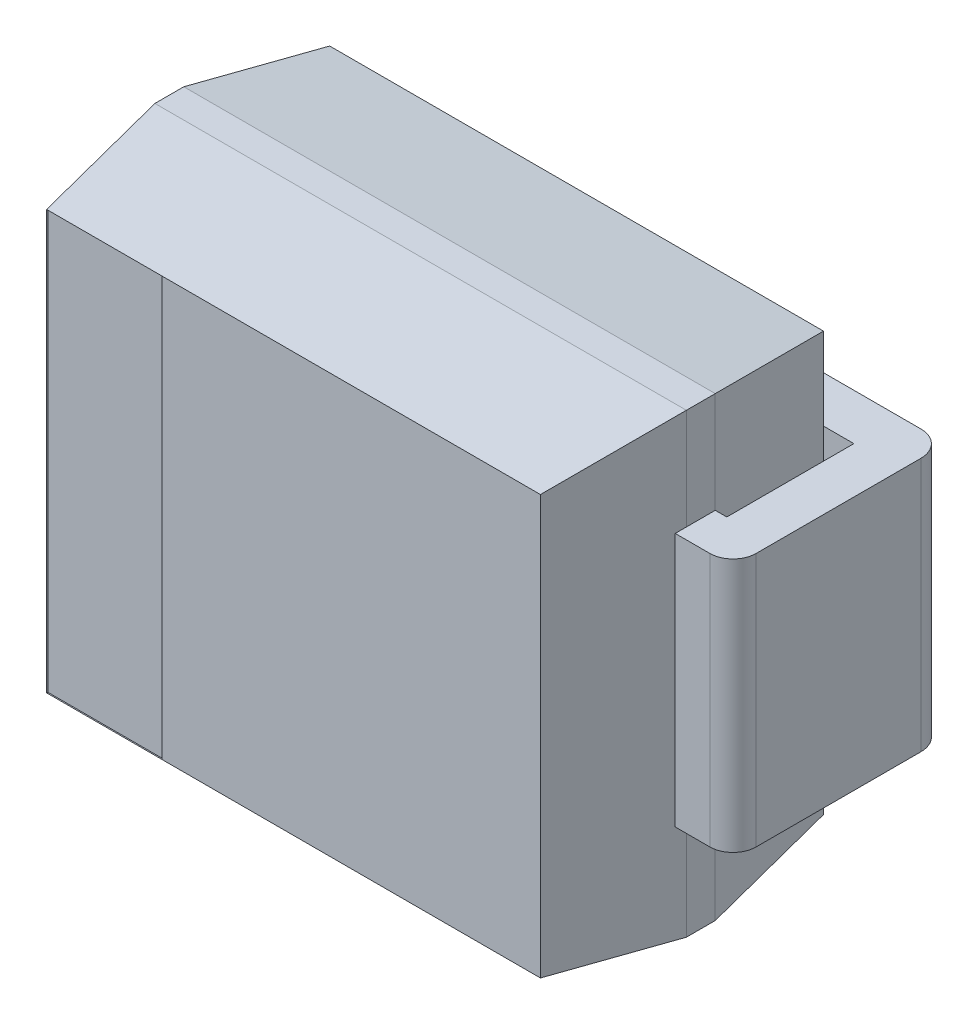
ISO-10303-21;
HEADER;
FILE_DESCRIPTION(('STEP AP214'),'2;1');
FILE_NAME('part.step','',(''),(''),'','','');
FILE_SCHEMA(('AUTOMOTIVE_DESIGN { 1 0 10303 214 1 1 1 1 }'));
ENDSEC;
DATA;
#1=APPLICATION_CONTEXT('core data for automotive mechanical design processes');
#2=APPLICATION_PROTOCOL_DEFINITION('international standard','automotive_design',2000,#1);
#3=PRODUCT_CONTEXT('',#1,'mechanical');
#4=PRODUCT('Part','Part','',(#3));
#5=PRODUCT_RELATED_PRODUCT_CATEGORY('part','',(#4));
#6=PRODUCT_DEFINITION_FORMATION('','',#4);
#7=PRODUCT_DEFINITION_CONTEXT('part definition',#1,'design');
#8=PRODUCT_DEFINITION('design','',#6,#7);
#9=PRODUCT_DEFINITION_SHAPE('','',#8);
#10=(LENGTH_UNIT() NAMED_UNIT(*) SI_UNIT(.MILLI.,.METRE.));
#11=(NAMED_UNIT(*) PLANE_ANGLE_UNIT() SI_UNIT($,.RADIAN.));
#12=(NAMED_UNIT(*) SI_UNIT($,.STERADIAN.) SOLID_ANGLE_UNIT());
#13=UNCERTAINTY_MEASURE_WITH_UNIT(LENGTH_MEASURE(1.E-05),#10,'distance_accuracy_value','');
#14=(GEOMETRIC_REPRESENTATION_CONTEXT(3) GLOBAL_UNCERTAINTY_ASSIGNED_CONTEXT((#13)) GLOBAL_UNIT_ASSIGNED_CONTEXT((#10,
#11,#12)) REPRESENTATION_CONTEXT('',''));
#15=CARTESIAN_POINT('',(0.,0.,0.));
#16=DIRECTION('',(0.,0.,1.));
#17=DIRECTION('',(1.,0.,0.));
#18=AXIS2_PLACEMENT_3D('',#15,#16,#17);
#19=CARTESIAN_POINT('',(2.3,-1.1,1.8464101615138));
#20=DIRECTION('',(-1.,0.,0.));
#21=DIRECTION('',(0.,0.,-1.));
#22=AXIS2_PLACEMENT_3D('',#19,#20,#21);
#23=PLANE('',#22);
#24=DIRECTION('',(0.,1.,0.));
#25=VECTOR('',#24,1.);
#26=CARTESIAN_POINT('',(2.3,-1.1,1.50000000000002));
#27=LINE('',#26,#25);
#28=CARTESIAN_POINT('',(2.3,-1.1,1.50000000000002));
#29=VERTEX_POINT('',#28);
#30=CARTESIAN_POINT('',(2.3,1.1,1.50000000000002));
#31=VERTEX_POINT('',#30);
#32=EDGE_CURVE('E53',#29,#31,#27,.T.);
#33=ORIENTED_EDGE('',*,*,#32,.F.);
#34=DIRECTION('',(0.,0.,-1.));
#35=VECTOR('',#34,1.);
#36=CARTESIAN_POINT('',(2.3,-1.1,1.8464101615138));
#37=LINE('',#36,#35);
#38=CARTESIAN_POINT('',(2.3,-1.1,1.8464101615138));
#39=VERTEX_POINT('',#38);
#40=EDGE_CURVE('E199',#39,#29,#37,.T.);
#41=ORIENTED_EDGE('',*,*,#40,.F.);
#42=DIRECTION('',(0.,1.,0.));
#43=VECTOR('',#42,1.);
#44=CARTESIAN_POINT('',(2.3,-1.1,1.8464101615138));
#45=LINE('',#44,#43);
#46=CARTESIAN_POINT('',(2.3,1.1,1.8464101615138));
#47=VERTEX_POINT('',#46);
#48=EDGE_CURVE('E12',#39,#47,#45,.T.);
#49=ORIENTED_EDGE('',*,*,#48,.T.);
#50=DIRECTION('',(0.,0.,-1.));
#51=VECTOR('',#50,1.);
#52=CARTESIAN_POINT('',(2.3,1.1,1.8464101615138));
#53=LINE('',#52,#51);
#54=EDGE_CURVE('E132',#47,#31,#53,.T.);
#55=ORIENTED_EDGE('',*,*,#54,.T.);
#56=EDGE_LOOP('',(#33,#41,#49,#55));
#57=FACE_BOUND('',#56,.T.);
#58=ADVANCED_FACE('F50',(#57),#23,.T.);
#59=CARTESIAN_POINT('',(2.6,-1.1,1.8464101615138));
#60=DIRECTION('',(0.,0.,1.));
#61=DIRECTION('',(-1.,0.,0.));
#62=AXIS2_PLACEMENT_3D('',#59,#60,#61);
#63=PLANE('',#62);
#64=ORIENTED_EDGE('',*,*,#48,.F.);
#65=DIRECTION('',(-1.,0.,0.));
#66=VECTOR('',#65,1.);
#67=CARTESIAN_POINT('',(2.6,-1.1,1.8464101615138));
#68=LINE('',#67,#66);
#69=CARTESIAN_POINT('',(2.6,-1.1,1.8464101615138));
#70=VERTEX_POINT('',#69);
#71=EDGE_CURVE('E66',#70,#39,#68,.T.);
#72=ORIENTED_EDGE('',*,*,#71,.F.);
#73=DIRECTION('',(0.,1.,0.));
#74=VECTOR('',#73,1.);
#75=CARTESIAN_POINT('',(2.6,-1.1,1.8464101615138));
#76=LINE('',#75,#74);
#77=CARTESIAN_POINT('',(2.6,1.1,1.8464101615138));
#78=VERTEX_POINT('',#77);
#79=EDGE_CURVE('E58',#70,#78,#76,.T.);
#80=ORIENTED_EDGE('',*,*,#79,.T.);
#81=DIRECTION('',(-1.,0.,0.));
#82=VECTOR('',#81,1.);
#83=CARTESIAN_POINT('',(2.6,1.1,1.8464101615138));
#84=LINE('',#83,#82);
#85=EDGE_CURVE('E197',#78,#47,#84,.T.);
#86=ORIENTED_EDGE('',*,*,#85,.T.);
#87=EDGE_LOOP('',(#64,#72,#80,#86));
#88=FACE_BOUND('',#87,.T.);
#89=ADVANCED_FACE('F221',(#88),#63,.T.);
#90=CARTESIAN_POINT('',(2.6,-1.1,1.6464101615138));
#91=DIRECTION('',(0.,1.,0.));
#92=DIRECTION('',(0.,0.,1.));
#93=AXIS2_PLACEMENT_3D('',#90,#91,#92);
#94=CYLINDRICAL_SURFACE('',#93,0.2);
#95=ORIENTED_EDGE('',*,*,#79,.F.);
#96=CARTESIAN_POINT('',(2.6,-1.1,1.6464101615138));
#97=DIRECTION('',(0.,-1.,0.));
#98=DIRECTION('',(0.,0.,-1.));
#99=AXIS2_PLACEMENT_3D('',#96,#97,#98);
#100=CIRCLE('',#99,0.2);
#101=CARTESIAN_POINT('',(2.8,-1.1,1.6464101615138));
#102=VERTEX_POINT('',#101);
#103=EDGE_CURVE('E71',#102,#70,#100,.T.);
#104=ORIENTED_EDGE('',*,*,#103,.F.);
#105=DIRECTION('',(0.,1.,0.));
#106=VECTOR('',#105,1.);
#107=CARTESIAN_POINT('',(2.8,-1.1,1.6464101615138));
#108=LINE('',#107,#106);
#109=CARTESIAN_POINT('',(2.8,1.1,1.6464101615138));
#110=VERTEX_POINT('',#109);
#111=EDGE_CURVE('E155',#102,#110,#108,.T.);
#112=ORIENTED_EDGE('',*,*,#111,.T.);
#113=CARTESIAN_POINT('',(2.6,1.1,1.6464101615138));
#114=DIRECTION('',(0.,-1.,0.));
#115=DIRECTION('',(0.,0.,-1.));
#116=AXIS2_PLACEMENT_3D('',#113,#114,#115);
#117=CIRCLE('',#116,0.2);
#118=EDGE_CURVE('E195',#110,#78,#117,.T.);
#119=ORIENTED_EDGE('',*,*,#118,.T.);
#120=EDGE_LOOP('',(#95,#104,#112,#119));
#121=FACE_BOUND('',#120,.T.);
#122=ADVANCED_FACE('F219',(#121),#94,.T.);
#123=CARTESIAN_POINT('',(2.8,-1.1,1.6464101615138));
#124=DIRECTION('',(1.,0.,0.));
#125=DIRECTION('',(0.,0.,1.));
#126=AXIS2_PLACEMENT_3D('',#123,#124,#125);
#127=PLANE('',#126);
#128=ORIENTED_EDGE('',*,*,#111,.F.);
#129=DIRECTION('',(0.,0.,1.));
#130=VECTOR('',#129,1.);
#131=CARTESIAN_POINT('',(2.8,-1.1,1.6464101615138));
#132=LINE('',#131,#130);
#133=CARTESIAN_POINT('',(2.8,-1.1,0.22));
#134=VERTEX_POINT('',#133);
#135=EDGE_CURVE('E149',#134,#102,#132,.T.);
#136=ORIENTED_EDGE('',*,*,#135,.F.);
#137=DIRECTION('',(0.,1.,0.));
#138=VECTOR('',#137,1.);
#139=CARTESIAN_POINT('',(2.8,-1.1,0.22));
#140=LINE('',#139,#138);
#141=CARTESIAN_POINT('',(2.8,1.1,0.22));
#142=VERTEX_POINT('',#141);
#143=EDGE_CURVE('E158',#134,#142,#140,.T.);
#144=ORIENTED_EDGE('',*,*,#143,.T.);
#145=DIRECTION('',(0.,0.,1.));
#146=VECTOR('',#145,1.);
#147=CARTESIAN_POINT('',(2.8,1.1,1.6464101615138));
#148=LINE('',#147,#146);
#149=EDGE_CURVE('E193',#142,#110,#148,.T.);
#150=ORIENTED_EDGE('',*,*,#149,.T.);
#151=EDGE_LOOP('',(#128,#136,#144,#150));
#152=FACE_BOUND('',#151,.T.);
#153=ADVANCED_FACE('F215',(#152),#127,.T.);
#154=CARTESIAN_POINT('',(2.58,-1.1,0.22));
#155=DIRECTION('',(0.,1.,0.));
#156=DIRECTION('',(0.,0.,1.));
#157=AXIS2_PLACEMENT_3D('',#154,#155,#156);
#158=CYLINDRICAL_SURFACE('',#157,0.22);
#159=ORIENTED_EDGE('',*,*,#143,.F.);
#160=CARTESIAN_POINT('',(2.58,-1.1,0.22));
#161=DIRECTION('',(0.,-1.,0.));
#162=DIRECTION('',(0.,0.,1.));
#163=AXIS2_PLACEMENT_3D('',#160,#161,#162);
#164=CIRCLE('',#163,0.22);
#165=CARTESIAN_POINT('',(2.58,-1.1,0.));
#166=VERTEX_POINT('',#165);
#167=EDGE_CURVE('E208',#166,#134,#164,.T.);
#168=ORIENTED_EDGE('',*,*,#167,.F.);
#169=DIRECTION('',(0.,1.,0.));
#170=VECTOR('',#169,1.);
#171=CARTESIAN_POINT('',(2.58,-1.1,0.));
#172=LINE('',#171,#170);
#173=CARTESIAN_POINT('',(2.58,1.1,0.));
#174=VERTEX_POINT('',#173);
#175=EDGE_CURVE('E161',#166,#174,#172,.T.);
#176=ORIENTED_EDGE('',*,*,#175,.T.);
#177=CARTESIAN_POINT('',(2.58,1.1,0.22));
#178=DIRECTION('',(0.,-1.,0.));
#179=DIRECTION('',(0.,0.,1.));
#180=AXIS2_PLACEMENT_3D('',#177,#178,#179);
#181=CIRCLE('',#180,0.22);
#182=EDGE_CURVE('E191',#174,#142,#181,.T.);
#183=ORIENTED_EDGE('',*,*,#182,.T.);
#184=EDGE_LOOP('',(#159,#168,#176,#183));
#185=FACE_BOUND('',#184,.T.);
#186=ADVANCED_FACE('F232',(#185),#158,.T.);
#187=CARTESIAN_POINT('',(1.3,-1.1,0.));
#188=DIRECTION('',(0.,0.,-1.));
#189=DIRECTION('',(1.,0.,0.));
#190=AXIS2_PLACEMENT_3D('',#187,#188,#189);
#191=PLANE('',#190);
#192=ORIENTED_EDGE('',*,*,#175,.F.);
#193=DIRECTION('',(1.,0.,0.));
#194=VECTOR('',#193,1.);
#195=CARTESIAN_POINT('',(1.3,-1.1,0.));
#196=LINE('',#195,#194);
#197=CARTESIAN_POINT('',(1.3,-1.1,0.));
#198=VERTEX_POINT('',#197);
#199=EDGE_CURVE('E206',#198,#166,#196,.T.);
#200=ORIENTED_EDGE('',*,*,#199,.F.);
#201=DIRECTION('',(0.,1.,0.));
#202=VECTOR('',#201,1.);
#203=CARTESIAN_POINT('',(1.3,-1.1,0.));
#204=LINE('',#203,#202);
#205=CARTESIAN_POINT('',(1.3,1.1,0.));
#206=VERTEX_POINT('',#205);
#207=EDGE_CURVE('E164',#198,#206,#204,.T.);
#208=ORIENTED_EDGE('',*,*,#207,.T.);
#209=DIRECTION('',(1.,0.,0.));
#210=VECTOR('',#209,1.);
#211=CARTESIAN_POINT('',(1.3,1.1,0.));
#212=LINE('',#211,#210);
#213=EDGE_CURVE('E187',#206,#174,#212,.T.);
#214=ORIENTED_EDGE('',*,*,#213,.T.);
#215=EDGE_LOOP('',(#192,#200,#208,#214));
#216=FACE_BOUND('',#215,.T.);
#217=ADVANCED_FACE('F229',(#216),#191,.T.);
#218=CARTESIAN_POINT('',(1.3,-1.1,0.));
#219=DIRECTION('',(-1.,0.,0.));
#220=DIRECTION('',(0.,0.,-1.));
#221=AXIS2_PLACEMENT_3D('',#218,#219,#220);
#222=PLANE('',#221);
#223=ORIENTED_EDGE('',*,*,#207,.F.);
#224=DIRECTION('',(0.,0.,-1.));
#225=VECTOR('',#224,1.);
#226=CARTESIAN_POINT('',(1.3,-1.1,0.));
#227=LINE('',#226,#225);
#228=CARTESIAN_POINT('',(1.3,-1.1,0.4));
#229=VERTEX_POINT('',#228);
#230=EDGE_CURVE('E204',#229,#198,#227,.T.);
#231=ORIENTED_EDGE('',*,*,#230,.F.);
#232=DIRECTION('',(0.,1.,0.));
#233=VECTOR('',#232,1.);
#234=CARTESIAN_POINT('',(1.3,-1.1,0.4));
#235=LINE('',#234,#233);
#236=CARTESIAN_POINT('',(1.3,1.1,0.4));
#237=VERTEX_POINT('',#236);
#238=EDGE_CURVE('E167',#229,#237,#235,.T.);
#239=ORIENTED_EDGE('',*,*,#238,.T.);
#240=DIRECTION('',(0.,0.,-1.));
#241=VECTOR('',#240,1.);
#242=CARTESIAN_POINT('',(1.3,1.1,0.));
#243=LINE('',#242,#241);
#244=EDGE_CURVE('E185',#237,#206,#243,.T.);
#245=ORIENTED_EDGE('',*,*,#244,.T.);
#246=EDGE_LOOP('',(#223,#231,#239,#245));
#247=FACE_BOUND('',#246,.T.);
#248=ADVANCED_FACE('F225',(#247),#222,.T.);
#249=CARTESIAN_POINT('',(1.3,-1.1,0.4));
#250=DIRECTION('',(0.,0.,1.));
#251=DIRECTION('',(-1.,0.,0.));
#252=AXIS2_PLACEMENT_3D('',#249,#250,#251);
#253=PLANE('',#252);
#254=ORIENTED_EDGE('',*,*,#238,.F.);
#255=DIRECTION('',(-1.,0.,0.));
#256=VECTOR('',#255,1.);
#257=CARTESIAN_POINT('',(1.3,-1.1,0.4));
#258=LINE('',#257,#256);
#259=CARTESIAN_POINT('',(2.4,-1.1,0.4));
#260=VERTEX_POINT('',#259);
#261=EDGE_CURVE('E178',#260,#229,#258,.T.);
#262=ORIENTED_EDGE('',*,*,#261,.F.);
#263=DIRECTION('',(0.,1.,0.));
#264=VECTOR('',#263,1.);
#265=CARTESIAN_POINT('',(2.4,-1.1,0.4));
#266=LINE('',#265,#264);
#267=CARTESIAN_POINT('',(2.4,1.1,0.4));
#268=VERTEX_POINT('',#267);
#269=EDGE_CURVE('E147',#260,#268,#266,.T.);
#270=ORIENTED_EDGE('',*,*,#269,.T.);
#271=DIRECTION('',(-1.,0.,0.));
#272=VECTOR('',#271,1.);
#273=CARTESIAN_POINT('',(1.3,1.1,0.4));
#274=LINE('',#273,#272);
#275=EDGE_CURVE('E176',#268,#237,#274,.T.);
#276=ORIENTED_EDGE('',*,*,#275,.T.);
#277=EDGE_LOOP('',(#254,#262,#270,#276));
#278=FACE_BOUND('',#277,.T.);
#279=ADVANCED_FACE('F175',(#278),#253,.T.);
#280=CARTESIAN_POINT('',(2.4,-1.1,0.4));
#281=DIRECTION('',(-1.,0.,0.));
#282=DIRECTION('',(0.,0.,-1.));
#283=AXIS2_PLACEMENT_3D('',#280,#281,#282);
#284=PLANE('',#283);
#285=ORIENTED_EDGE('',*,*,#269,.F.);
#286=DIRECTION('',(0.,0.,-1.));
#287=VECTOR('',#286,1.);
#288=CARTESIAN_POINT('',(2.4,-1.1,0.4));
#289=LINE('',#288,#287);
#290=CARTESIAN_POINT('',(2.4,-1.1,1.50000000000002));
#291=VERTEX_POINT('',#290);
#292=EDGE_CURVE('E182',#291,#260,#289,.T.);
#293=ORIENTED_EDGE('',*,*,#292,.F.);
#294=DIRECTION('',(0.,1.,0.));
#295=VECTOR('',#294,1.);
#296=CARTESIAN_POINT('',(2.4,-1.1,1.50000000000002));
#297=LINE('',#296,#295);
#298=CARTESIAN_POINT('',(2.4,1.1,1.50000000000002));
#299=VERTEX_POINT('',#298);
#300=EDGE_CURVE('E146',#291,#299,#297,.T.);
#301=ORIENTED_EDGE('',*,*,#300,.T.);
#302=DIRECTION('',(0.,0.,-1.));
#303=VECTOR('',#302,1.);
#304=CARTESIAN_POINT('',(2.4,1.1,0.4));
#305=LINE('',#304,#303);
#306=EDGE_CURVE('E134',#299,#268,#305,.T.);
#307=ORIENTED_EDGE('',*,*,#306,.T.);
#308=EDGE_LOOP('',(#285,#293,#301,#307));
#309=FACE_BOUND('',#308,.T.);
#310=ADVANCED_FACE('F181',(#309),#284,.T.);
#311=CARTESIAN_POINT('',(2.3,-1.1,1.50000000000002));
#312=DIRECTION('',(0.,0.,-1.));
#313=DIRECTION('',(1.,0.,0.));
#314=AXIS2_PLACEMENT_3D('',#311,#312,#313);
#315=PLANE('',#314);
#316=ORIENTED_EDGE('',*,*,#300,.F.);
#317=DIRECTION('',(1.,0.,0.));
#318=VECTOR('',#317,1.);
#319=CARTESIAN_POINT('',(2.3,-1.1,1.50000000000002));
#320=LINE('',#319,#318);
#321=EDGE_CURVE('E145',#29,#291,#320,.T.);
#322=ORIENTED_EDGE('',*,*,#321,.F.);
#323=ORIENTED_EDGE('',*,*,#32,.T.);
#324=DIRECTION('',(1.,0.,0.));
#325=VECTOR('',#324,1.);
#326=CARTESIAN_POINT('',(2.3,1.1,1.50000000000002));
#327=LINE('',#326,#325);
#328=EDGE_CURVE('E128',#31,#299,#327,.T.);
#329=ORIENTED_EDGE('',*,*,#328,.T.);
#330=EDGE_LOOP('',(#316,#322,#323,#329));
#331=FACE_BOUND('',#330,.T.);
#332=ADVANCED_FACE('F144',(#331),#315,.T.);
#333=CARTESIAN_POINT('',(2.58,-1.1,0.22));
#334=DIRECTION('',(0.,1.,0.));
#335=DIRECTION('',(0.,0.,1.));
#336=AXIS2_PLACEMENT_3D('',#333,#334,#335);
#337=PLANE('',#336);
#338=ORIENTED_EDGE('',*,*,#40,.T.);
#339=ORIENTED_EDGE('',*,*,#321,.T.);
#340=ORIENTED_EDGE('',*,*,#292,.T.);
#341=ORIENTED_EDGE('',*,*,#261,.T.);
#342=ORIENTED_EDGE('',*,*,#230,.T.);
#343=ORIENTED_EDGE('',*,*,#199,.T.);
#344=ORIENTED_EDGE('',*,*,#167,.T.);
#345=ORIENTED_EDGE('',*,*,#135,.T.);
#346=ORIENTED_EDGE('',*,*,#103,.T.);
#347=ORIENTED_EDGE('',*,*,#71,.T.);
#348=EDGE_LOOP('',(#338,#339,#340,#341,#342,#343,#344,#345,#346,#347));
#349=FACE_BOUND('',#348,.T.);
#350=ADVANCED_FACE('F211',(#349),#337,.F.);
#351=CARTESIAN_POINT('',(2.58,1.1,0.22));
#352=DIRECTION('',(0.,1.,0.));
#353=DIRECTION('',(0.,0.,1.));
#354=AXIS2_PLACEMENT_3D('',#351,#352,#353);
#355=PLANE('',#354);
#356=ORIENTED_EDGE('',*,*,#54,.F.);
#357=ORIENTED_EDGE('',*,*,#85,.F.);
#358=ORIENTED_EDGE('',*,*,#118,.F.);
#359=ORIENTED_EDGE('',*,*,#149,.F.);
#360=ORIENTED_EDGE('',*,*,#182,.F.);
#361=ORIENTED_EDGE('',*,*,#213,.F.);
#362=ORIENTED_EDGE('',*,*,#244,.F.);
#363=ORIENTED_EDGE('',*,*,#275,.F.);
#364=ORIENTED_EDGE('',*,*,#306,.F.);
#365=ORIENTED_EDGE('',*,*,#328,.F.);
#366=EDGE_LOOP('',(#356,#357,#358,#359,#360,#361,#362,#363,#364,#365));
#367=FACE_BOUND('',#366,.T.);
#368=ADVANCED_FACE('F130',(#367),#355,.T.);
#369=CLOSED_SHELL('',(#58,#89,#122,#153,#186,#217,#248,#279,#310,#332,#350,#368));
#370=MANIFOLD_SOLID_BREP('B2',#369);
#371=CARTESIAN_POINT('',(-2.3,-1.1,1.8464101615138));
#372=DIRECTION('',(1.,0.,0.));
#373=DIRECTION('',(0.,0.,-1.));
#374=AXIS2_PLACEMENT_3D('',#371,#372,#373);
#375=PLANE('',#374);
#376=DIRECTION('',(0.,1.,0.));
#377=VECTOR('',#376,1.);
#378=CARTESIAN_POINT('',(-2.3,-1.1,1.50000000000002));
#379=LINE('',#378,#377);
#380=CARTESIAN_POINT('',(-2.3,-1.1,1.50000000000002));
#381=VERTEX_POINT('',#380);
#382=CARTESIAN_POINT('',(-2.3,1.1,1.50000000000002));
#383=VERTEX_POINT('',#382);
#384=EDGE_CURVE('E366',#381,#383,#379,.T.);
#385=ORIENTED_EDGE('',*,*,#384,.T.);
#386=DIRECTION('',(0.,0.,-1.));
#387=VECTOR('',#386,1.);
#388=CARTESIAN_POINT('',(-2.3,1.1,1.8464101615138));
#389=LINE('',#388,#387);
#390=CARTESIAN_POINT('',(-2.3,1.1,1.8464101615138));
#391=VERTEX_POINT('',#390);
#392=EDGE_CURVE('E439',#391,#383,#389,.T.);
#393=ORIENTED_EDGE('',*,*,#392,.F.);
#394=DIRECTION('',(0.,1.,0.));
#395=VECTOR('',#394,1.);
#396=CARTESIAN_POINT('',(-2.3,-1.1,1.8464101615138));
#397=LINE('',#396,#395);
#398=CARTESIAN_POINT('',(-2.3,-1.1,1.8464101615138));
#399=VERTEX_POINT('',#398);
#400=EDGE_CURVE('E48',#399,#391,#397,.T.);
#401=ORIENTED_EDGE('',*,*,#400,.F.);
#402=DIRECTION('',(0.,0.,-1.));
#403=VECTOR('',#402,1.);
#404=CARTESIAN_POINT('',(-2.3,-1.1,1.8464101615138));
#405=LINE('',#404,#403);
#406=EDGE_CURVE('E440',#399,#381,#405,.T.);
#407=ORIENTED_EDGE('',*,*,#406,.T.);
#408=EDGE_LOOP('',(#385,#393,#401,#407));
#409=FACE_BOUND('',#408,.T.);
#410=ADVANCED_FACE('F363',(#409),#375,.T.);
#411=CARTESIAN_POINT('',(-2.6,-1.1,1.8464101615138));
#412=DIRECTION('',(0.,0.,1.));
#413=DIRECTION('',(1.,0.,0.));
#414=AXIS2_PLACEMENT_3D('',#411,#412,#413);
#415=PLANE('',#414);
#416=ORIENTED_EDGE('',*,*,#400,.T.);
#417=DIRECTION('',(1.,0.,0.));
#418=VECTOR('',#417,1.);
#419=CARTESIAN_POINT('',(-2.6,1.1,1.8464101615138));
#420=LINE('',#419,#418);
#421=CARTESIAN_POINT('',(-2.6,1.1,1.8464101615138));
#422=VERTEX_POINT('',#421);
#423=EDGE_CURVE('E457',#422,#391,#420,.T.);
#424=ORIENTED_EDGE('',*,*,#423,.F.);
#425=DIRECTION('',(0.,1.,0.));
#426=VECTOR('',#425,1.);
#427=CARTESIAN_POINT('',(-2.6,-1.1,1.8464101615138));
#428=LINE('',#427,#426);
#429=CARTESIAN_POINT('',(-2.6,-1.1,1.8464101615138));
#430=VERTEX_POINT('',#429);
#431=EDGE_CURVE('E371',#430,#422,#428,.T.);
#432=ORIENTED_EDGE('',*,*,#431,.F.);
#433=DIRECTION('',(1.,0.,0.));
#434=VECTOR('',#433,1.);
#435=CARTESIAN_POINT('',(-2.6,-1.1,1.8464101615138));
#436=LINE('',#435,#434);
#437=EDGE_CURVE('E445',#430,#399,#436,.T.);
#438=ORIENTED_EDGE('',*,*,#437,.T.);
#439=EDGE_LOOP('',(#416,#424,#432,#438));
#440=FACE_BOUND('',#439,.T.);
#441=ADVANCED_FACE('F545',(#440),#415,.T.);
#442=CARTESIAN_POINT('',(-2.6,-1.1,1.6464101615138));
#443=DIRECTION('',(0.,1.,0.));
#444=DIRECTION('',(0.,0.,1.));
#445=AXIS2_PLACEMENT_3D('',#442,#443,#444);
#446=CYLINDRICAL_SURFACE('',#445,0.2);
#447=ORIENTED_EDGE('',*,*,#431,.T.);
#448=CARTESIAN_POINT('',(-2.6,1.1,1.6464101615138));
#449=DIRECTION('',(0.,1.,0.));
#450=DIRECTION('',(0.,0.,-1.));
#451=AXIS2_PLACEMENT_3D('',#448,#449,#450);
#452=CIRCLE('',#451,0.2);
#453=CARTESIAN_POINT('',(-2.8,1.1,1.6464101615138));
#454=VERTEX_POINT('',#453);
#455=EDGE_CURVE('E476',#454,#422,#452,.T.);
#456=ORIENTED_EDGE('',*,*,#455,.F.);
#457=DIRECTION('',(0.,1.,0.));
#458=VECTOR('',#457,1.);
#459=CARTESIAN_POINT('',(-2.8,-1.1,1.6464101615138));
#460=LINE('',#459,#458);
#461=CARTESIAN_POINT('',(-2.8,-1.1,1.6464101615138));
#462=VERTEX_POINT('',#461);
#463=EDGE_CURVE('E504',#462,#454,#460,.T.);
#464=ORIENTED_EDGE('',*,*,#463,.F.);
#465=CARTESIAN_POINT('',(-2.6,-1.1,1.6464101615138));
#466=DIRECTION('',(0.,1.,0.));
#467=DIRECTION('',(0.,0.,-1.));
#468=AXIS2_PLACEMENT_3D('',#465,#466,#467);
#469=CIRCLE('',#468,0.2);
#470=EDGE_CURVE('E500',#462,#430,#469,.T.);
#471=ORIENTED_EDGE('',*,*,#470,.T.);
#472=EDGE_LOOP('',(#447,#456,#464,#471));
#473=FACE_BOUND('',#472,.T.);
#474=ADVANCED_FACE('F543',(#473),#446,.T.);
#475=CARTESIAN_POINT('',(-2.8,-1.1,1.6464101615138));
#476=DIRECTION('',(-1.,0.,0.));
#477=DIRECTION('',(0.,0.,1.));
#478=AXIS2_PLACEMENT_3D('',#475,#476,#477);
#479=PLANE('',#478);
#480=ORIENTED_EDGE('',*,*,#463,.T.);
#481=DIRECTION('',(0.,0.,1.));
#482=VECTOR('',#481,1.);
#483=CARTESIAN_POINT('',(-2.8,1.1,1.6464101615138));
#484=LINE('',#483,#482);
#485=CARTESIAN_POINT('',(-2.8,1.1,0.22));
#486=VERTEX_POINT('',#485);
#487=EDGE_CURVE('E473',#486,#454,#484,.T.);
#488=ORIENTED_EDGE('',*,*,#487,.F.);
#489=DIRECTION('',(0.,1.,0.));
#490=VECTOR('',#489,1.);
#491=CARTESIAN_POINT('',(-2.8,-1.1,0.22));
#492=LINE('',#491,#490);
#493=CARTESIAN_POINT('',(-2.8,-1.1,0.22));
#494=VERTEX_POINT('',#493);
#495=EDGE_CURVE('E506',#494,#486,#492,.T.);
#496=ORIENTED_EDGE('',*,*,#495,.F.);
#497=DIRECTION('',(0.,0.,1.));
#498=VECTOR('',#497,1.);
#499=CARTESIAN_POINT('',(-2.8,-1.1,1.6464101615138));
#500=LINE('',#499,#498);
#501=EDGE_CURVE('E497',#494,#462,#500,.T.);
#502=ORIENTED_EDGE('',*,*,#501,.T.);
#503=EDGE_LOOP('',(#480,#488,#496,#502));
#504=FACE_BOUND('',#503,.T.);
#505=ADVANCED_FACE('F539',(#504),#479,.T.);
#506=CARTESIAN_POINT('',(-2.58,-1.1,0.22));
#507=DIRECTION('',(0.,1.,0.));
#508=DIRECTION('',(0.,0.,1.));
#509=AXIS2_PLACEMENT_3D('',#506,#507,#508);
#510=CYLINDRICAL_SURFACE('',#509,0.22);
#511=ORIENTED_EDGE('',*,*,#495,.T.);
#512=CARTESIAN_POINT('',(-2.58,1.1,0.22));
#513=DIRECTION('',(0.,1.,0.));
#514=DIRECTION('',(0.,0.,1.));
#515=AXIS2_PLACEMENT_3D('',#512,#513,#514);
#516=CIRCLE('',#515,0.22);
#517=CARTESIAN_POINT('',(-2.58,1.1,0.));
#518=VERTEX_POINT('',#517);
#519=EDGE_CURVE('E470',#518,#486,#516,.T.);
#520=ORIENTED_EDGE('',*,*,#519,.F.);
#521=DIRECTION('',(0.,1.,0.));
#522=VECTOR('',#521,1.);
#523=CARTESIAN_POINT('',(-2.58,-1.1,0.));
#524=LINE('',#523,#522);
#525=CARTESIAN_POINT('',(-2.58,-1.1,0.));
#526=VERTEX_POINT('',#525);
#527=EDGE_CURVE('E508',#526,#518,#524,.T.);
#528=ORIENTED_EDGE('',*,*,#527,.F.);
#529=CARTESIAN_POINT('',(-2.58,-1.1,0.22));
#530=DIRECTION('',(0.,1.,0.));
#531=DIRECTION('',(0.,0.,1.));
#532=AXIS2_PLACEMENT_3D('',#529,#530,#531);
#533=CIRCLE('',#532,0.22);
#534=EDGE_CURVE('E494',#526,#494,#533,.T.);
#535=ORIENTED_EDGE('',*,*,#534,.T.);
#536=EDGE_LOOP('',(#511,#520,#528,#535));
#537=FACE_BOUND('',#536,.T.);
#538=ADVANCED_FACE('F537',(#537),#510,.T.);
#539=CARTESIAN_POINT('',(-1.3,-1.1,0.));
#540=DIRECTION('',(0.,0.,-1.));
#541=DIRECTION('',(-1.,0.,0.));
#542=AXIS2_PLACEMENT_3D('',#539,#540,#541);
#543=PLANE('',#542);
#544=ORIENTED_EDGE('',*,*,#527,.T.);
#545=DIRECTION('',(-1.,0.,0.));
#546=VECTOR('',#545,1.);
#547=CARTESIAN_POINT('',(-1.3,1.1,0.));
#548=LINE('',#547,#546);
#549=CARTESIAN_POINT('',(-1.3,1.1,0.));
#550=VERTEX_POINT('',#549);
#551=EDGE_CURVE('E467',#550,#518,#548,.T.);
#552=ORIENTED_EDGE('',*,*,#551,.F.);
#553=DIRECTION('',(0.,1.,0.));
#554=VECTOR('',#553,1.);
#555=CARTESIAN_POINT('',(-1.3,-1.1,0.));
#556=LINE('',#555,#554);
#557=CARTESIAN_POINT('',(-1.3,-1.1,0.));
#558=VERTEX_POINT('',#557);
#559=EDGE_CURVE('E510',#558,#550,#556,.T.);
#560=ORIENTED_EDGE('',*,*,#559,.F.);
#561=DIRECTION('',(-1.,0.,0.));
#562=VECTOR('',#561,1.);
#563=CARTESIAN_POINT('',(-1.3,-1.1,0.));
#564=LINE('',#563,#562);
#565=EDGE_CURVE('E491',#558,#526,#564,.T.);
#566=ORIENTED_EDGE('',*,*,#565,.T.);
#567=EDGE_LOOP('',(#544,#552,#560,#566));
#568=FACE_BOUND('',#567,.T.);
#569=ADVANCED_FACE('F532',(#568),#543,.T.);
#570=CARTESIAN_POINT('',(-1.3,-1.1,0.));
#571=DIRECTION('',(1.,0.,0.));
#572=DIRECTION('',(0.,0.,-1.));
#573=AXIS2_PLACEMENT_3D('',#570,#571,#572);
#574=PLANE('',#573);
#575=ORIENTED_EDGE('',*,*,#559,.T.);
#576=DIRECTION('',(0.,0.,-1.));
#577=VECTOR('',#576,1.);
#578=CARTESIAN_POINT('',(-1.3,1.1,0.));
#579=LINE('',#578,#577);
#580=CARTESIAN_POINT('',(-1.3,1.1,0.4));
#581=VERTEX_POINT('',#580);
#582=EDGE_CURVE('E464',#581,#550,#579,.T.);
#583=ORIENTED_EDGE('',*,*,#582,.F.);
#584=DIRECTION('',(0.,1.,0.));
#585=VECTOR('',#584,1.);
#586=CARTESIAN_POINT('',(-1.3,-1.1,0.4));
#587=LINE('',#586,#585);
#588=CARTESIAN_POINT('',(-1.3,-1.1,0.4));
#589=VERTEX_POINT('',#588);
#590=EDGE_CURVE('E512',#589,#581,#587,.T.);
#591=ORIENTED_EDGE('',*,*,#590,.F.);
#592=DIRECTION('',(0.,0.,-1.));
#593=VECTOR('',#592,1.);
#594=CARTESIAN_POINT('',(-1.3,-1.1,0.));
#595=LINE('',#594,#593);
#596=EDGE_CURVE('E488',#589,#558,#595,.T.);
#597=ORIENTED_EDGE('',*,*,#596,.T.);
#598=EDGE_LOOP('',(#575,#583,#591,#597));
#599=FACE_BOUND('',#598,.T.);
#600=ADVANCED_FACE('F525',(#599),#574,.T.);
#601=CARTESIAN_POINT('',(-1.3,-1.1,0.4));
#602=DIRECTION('',(0.,0.,1.));
#603=DIRECTION('',(1.,0.,0.));
#604=AXIS2_PLACEMENT_3D('',#601,#602,#603);
#605=PLANE('',#604);
#606=ORIENTED_EDGE('',*,*,#590,.T.);
#607=DIRECTION('',(1.,0.,0.));
#608=VECTOR('',#607,1.);
#609=CARTESIAN_POINT('',(-1.3,1.1,0.4));
#610=LINE('',#609,#608);
#611=CARTESIAN_POINT('',(-2.4,1.1,0.4));
#612=VERTEX_POINT('',#611);
#613=EDGE_CURVE('E461',#612,#581,#610,.T.);
#614=ORIENTED_EDGE('',*,*,#613,.F.);
#615=DIRECTION('',(0.,1.,0.));
#616=VECTOR('',#615,1.);
#617=CARTESIAN_POINT('',(-2.4,-1.1,0.4));
#618=LINE('',#617,#616);
#619=CARTESIAN_POINT('',(-2.4,-1.1,0.4));
#620=VERTEX_POINT('',#619);
#621=EDGE_CURVE('E514',#620,#612,#618,.T.);
#622=ORIENTED_EDGE('',*,*,#621,.F.);
#623=DIRECTION('',(1.,0.,0.));
#624=VECTOR('',#623,1.);
#625=CARTESIAN_POINT('',(-1.3,-1.1,0.4));
#626=LINE('',#625,#624);
#627=EDGE_CURVE('E485',#620,#589,#626,.T.);
#628=ORIENTED_EDGE('',*,*,#627,.T.);
#629=EDGE_LOOP('',(#606,#614,#622,#628));
#630=FACE_BOUND('',#629,.T.);
#631=ADVANCED_FACE('F522',(#630),#605,.T.);
#632=CARTESIAN_POINT('',(-2.4,-1.1,0.4));
#633=DIRECTION('',(1.,0.,0.));
#634=DIRECTION('',(0.,0.,-1.));
#635=AXIS2_PLACEMENT_3D('',#632,#633,#634);
#636=PLANE('',#635);
#637=ORIENTED_EDGE('',*,*,#621,.T.);
#638=DIRECTION('',(0.,0.,-1.));
#639=VECTOR('',#638,1.);
#640=CARTESIAN_POINT('',(-2.4,1.1,0.4));
#641=LINE('',#640,#639);
#642=CARTESIAN_POINT('',(-2.4,1.1,1.50000000000002));
#643=VERTEX_POINT('',#642);
#644=EDGE_CURVE('E452',#643,#612,#641,.T.);
#645=ORIENTED_EDGE('',*,*,#644,.F.);
#646=DIRECTION('',(0.,1.,0.));
#647=VECTOR('',#646,1.);
#648=CARTESIAN_POINT('',(-2.4,-1.1,1.50000000000002));
#649=LINE('',#648,#647);
#650=CARTESIAN_POINT('',(-2.4,-1.1,1.50000000000002));
#651=VERTEX_POINT('',#650);
#652=EDGE_CURVE('E444',#651,#643,#649,.T.);
#653=ORIENTED_EDGE('',*,*,#652,.F.);
#654=DIRECTION('',(0.,0.,-1.));
#655=VECTOR('',#654,1.);
#656=CARTESIAN_POINT('',(-2.4,-1.1,0.4));
#657=LINE('',#656,#655);
#658=EDGE_CURVE('E482',#651,#620,#657,.T.);
#659=ORIENTED_EDGE('',*,*,#658,.T.);
#660=EDGE_LOOP('',(#637,#645,#653,#659));
#661=FACE_BOUND('',#660,.T.);
#662=ADVANCED_FACE('F516',(#661),#636,.T.);
#663=CARTESIAN_POINT('',(-2.3,-1.1,1.50000000000002));
#664=DIRECTION('',(0.,0.,-1.));
#665=DIRECTION('',(-1.,0.,0.));
#666=AXIS2_PLACEMENT_3D('',#663,#664,#665);
#667=PLANE('',#666);
#668=ORIENTED_EDGE('',*,*,#652,.T.);
#669=DIRECTION('',(-1.,0.,0.));
#670=VECTOR('',#669,1.);
#671=CARTESIAN_POINT('',(-2.3,1.1,1.50000000000002));
#672=LINE('',#671,#670);
#673=EDGE_CURVE('E447',#383,#643,#672,.T.);
#674=ORIENTED_EDGE('',*,*,#673,.F.);
#675=ORIENTED_EDGE('',*,*,#384,.F.);
#676=DIRECTION('',(-1.,0.,0.));
#677=VECTOR('',#676,1.);
#678=CARTESIAN_POINT('',(-2.3,-1.1,1.50000000000002));
#679=LINE('',#678,#677);
#680=EDGE_CURVE('E480',#381,#651,#679,.T.);
#681=ORIENTED_EDGE('',*,*,#680,.T.);
#682=EDGE_LOOP('',(#668,#674,#675,#681));
#683=FACE_BOUND('',#682,.T.);
#684=ADVANCED_FACE('F448',(#683),#667,.T.);
#685=CARTESIAN_POINT('',(-2.58,-1.1,0.22));
#686=DIRECTION('',(0.,1.,0.));
#687=DIRECTION('',(0.,0.,1.));
#688=AXIS2_PLACEMENT_3D('',#685,#686,#687);
#689=PLANE('',#688);
#690=ORIENTED_EDGE('',*,*,#406,.F.);
#691=ORIENTED_EDGE('',*,*,#437,.F.);
#692=ORIENTED_EDGE('',*,*,#470,.F.);
#693=ORIENTED_EDGE('',*,*,#501,.F.);
#694=ORIENTED_EDGE('',*,*,#534,.F.);
#695=ORIENTED_EDGE('',*,*,#565,.F.);
#696=ORIENTED_EDGE('',*,*,#596,.F.);
#697=ORIENTED_EDGE('',*,*,#627,.F.);
#698=ORIENTED_EDGE('',*,*,#658,.F.);
#699=ORIENTED_EDGE('',*,*,#680,.F.);
#700=EDGE_LOOP('',(#690,#691,#692,#693,#694,#695,#696,#697,#698,#699));
#701=FACE_BOUND('',#700,.T.);
#702=ADVANCED_FACE('F528',(#701),#689,.F.);
#703=CARTESIAN_POINT('',(-2.58,1.1,0.22));
#704=DIRECTION('',(0.,1.,0.));
#705=DIRECTION('',(0.,0.,1.));
#706=AXIS2_PLACEMENT_3D('',#703,#704,#705);
#707=PLANE('',#706);
#708=ORIENTED_EDGE('',*,*,#392,.T.);
#709=ORIENTED_EDGE('',*,*,#673,.T.);
#710=ORIENTED_EDGE('',*,*,#644,.T.);
#711=ORIENTED_EDGE('',*,*,#613,.T.);
#712=ORIENTED_EDGE('',*,*,#582,.T.);
#713=ORIENTED_EDGE('',*,*,#551,.T.);
#714=ORIENTED_EDGE('',*,*,#519,.T.);
#715=ORIENTED_EDGE('',*,*,#487,.T.);
#716=ORIENTED_EDGE('',*,*,#455,.T.);
#717=ORIENTED_EDGE('',*,*,#423,.T.);
#718=EDGE_LOOP('',(#708,#709,#710,#711,#712,#713,#714,#715,#716,#717));
#719=FACE_BOUND('',#718,.T.);
#720=ADVANCED_FACE('F455',(#719),#707,.T.);
#721=CLOSED_SHELL('',(#410,#441,#474,#505,#538,#569,#600,#631,#662,#684,#702,#720));
#722=MANIFOLD_SOLID_BREP('B6',#721);
#723=CARTESIAN_POINT('',(2.3,1.975,2.85));
#724=DIRECTION('',(-1.,0.,0.));
#725=DIRECTION('',(0.,-1.,0.));
#726=AXIS2_PLACEMENT_3D('',#723,#724,#725);
#727=PLANE('',#726);
#728=DIRECTION('',(0.,0.,-1.));
#729=VECTOR('',#728,1.);
#730=CARTESIAN_POINT('',(2.3,-1.975,2.85));
#731=LINE('',#730,#729);
#732=CARTESIAN_POINT('',(2.3,-1.975,1.74999999999998));
#733=VERTEX_POINT('',#732);
#734=CARTESIAN_POINT('',(2.3,-1.975,1.50000000000002));
#735=VERTEX_POINT('',#734);
#736=EDGE_CURVE('E766',#733,#735,#731,.T.);
#737=ORIENTED_EDGE('',*,*,#736,.T.);
#738=DIRECTION('',(0.,1.,0.));
#739=VECTOR('',#738,1.);
#740=CARTESIAN_POINT('',(2.3,1.975,1.50000000000002));
#741=LINE('',#740,#739);
#742=CARTESIAN_POINT('',(2.3,1.975,1.50000000000002));
#743=VERTEX_POINT('',#742);
#744=EDGE_CURVE('E795',#735,#743,#741,.T.);
#745=ORIENTED_EDGE('',*,*,#744,.T.);
#746=DIRECTION('',(0.,0.,-1.));
#747=VECTOR('',#746,1.);
#748=CARTESIAN_POINT('',(2.3,1.975,2.85));
#749=LINE('',#748,#747);
#750=CARTESIAN_POINT('',(2.3,1.975,1.74999999999998));
#751=VERTEX_POINT('',#750);
#752=EDGE_CURVE('E774',#751,#743,#749,.T.);
#753=ORIENTED_EDGE('',*,*,#752,.F.);
#754=DIRECTION('',(0.,-1.,0.));
#755=VECTOR('',#754,1.);
#756=CARTESIAN_POINT('',(2.3,-1.975,1.74999999999998));
#757=LINE('',#756,#755);
#758=EDGE_CURVE('E789',#751,#733,#757,.T.);
#759=ORIENTED_EDGE('',*,*,#758,.T.);
#760=EDGE_LOOP('',(#737,#745,#753,#759));
#761=FACE_BOUND('',#760,.T.);
#762=ADVANCED_FACE('F643',(#761),#727,.F.);
#763=CARTESIAN_POINT('',(-2.3,1.975,2.85));
#764=DIRECTION('',(0.,-1.,0.));
#765=DIRECTION('',(0.,0.,-1.));
#766=AXIS2_PLACEMENT_3D('',#763,#764,#765);
#767=PLANE('',#766);
#768=ORIENTED_EDGE('',*,*,#752,.T.);
#769=DIRECTION('',(-1.,0.,0.));
#770=VECTOR('',#769,1.);
#771=CARTESIAN_POINT('',(-2.3,1.975,1.50000000000002));
#772=LINE('',#771,#770);
#773=CARTESIAN_POINT('',(-2.3,1.975,1.50000000000002));
#774=VERTEX_POINT('',#773);
#775=EDGE_CURVE('E817',#743,#774,#772,.T.);
#776=ORIENTED_EDGE('',*,*,#775,.T.);
#777=DIRECTION('',(0.,0.,-1.));
#778=VECTOR('',#777,1.);
#779=CARTESIAN_POINT('',(-2.3,1.975,2.85));
#780=LINE('',#779,#778);
#781=CARTESIAN_POINT('',(-2.3,1.975,1.74999999999998));
#782=VERTEX_POINT('',#781);
#783=EDGE_CURVE('E772',#782,#774,#780,.T.);
#784=ORIENTED_EDGE('',*,*,#783,.F.);
#785=DIRECTION('',(1.,0.,0.));
#786=VECTOR('',#785,1.);
#787=CARTESIAN_POINT('',(2.3,1.975,1.74999999999998));
#788=LINE('',#787,#786);
#789=EDGE_CURVE('E786',#782,#751,#788,.T.);
#790=ORIENTED_EDGE('',*,*,#789,.T.);
#791=EDGE_LOOP('',(#768,#776,#784,#790));
#792=FACE_BOUND('',#791,.T.);
#793=ADVANCED_FACE('F850',(#792),#767,.F.);
#794=CARTESIAN_POINT('',(-2.3,1.975,2.85));
#795=DIRECTION('',(1.,0.,0.));
#796=DIRECTION('',(0.,1.,0.));
#797=AXIS2_PLACEMENT_3D('',#794,#795,#796);
#798=PLANE('',#797);
#799=ORIENTED_EDGE('',*,*,#783,.T.);
#800=DIRECTION('',(0.,-1.,0.));
#801=VECTOR('',#800,1.);
#802=CARTESIAN_POINT('',(-2.3,1.975,1.50000000000002));
#803=LINE('',#802,#801);
#804=CARTESIAN_POINT('',(-2.3,-1.975,1.50000000000002));
#805=VERTEX_POINT('',#804);
#806=EDGE_CURVE('E361',#774,#805,#803,.T.);
#807=ORIENTED_EDGE('',*,*,#806,.T.);
#808=DIRECTION('',(0.,0.,-1.));
#809=VECTOR('',#808,1.);
#810=CARTESIAN_POINT('',(-2.3,-1.975,2.85));
#811=LINE('',#810,#809);
#812=CARTESIAN_POINT('',(-2.3,-1.975,1.74999999999998));
#813=VERTEX_POINT('',#812);
#814=EDGE_CURVE('E769',#813,#805,#811,.T.);
#815=ORIENTED_EDGE('',*,*,#814,.F.);
#816=DIRECTION('',(0.,1.,0.));
#817=VECTOR('',#816,1.);
#818=CARTESIAN_POINT('',(-2.3,1.975,1.74999999999998));
#819=LINE('',#818,#817);
#820=EDGE_CURVE('E793',#813,#782,#819,.T.);
#821=ORIENTED_EDGE('',*,*,#820,.T.);
#822=EDGE_LOOP('',(#799,#807,#815,#821));
#823=FACE_BOUND('',#822,.T.);
#824=ADVANCED_FACE('F887',(#823),#798,.F.);
#825=CARTESIAN_POINT('',(-2.3,-1.975,2.85));
#826=DIRECTION('',(0.,1.,0.));
#827=DIRECTION('',(0.,0.,1.));
#828=AXIS2_PLACEMENT_3D('',#825,#826,#827);
#829=PLANE('',#828);
#830=ORIENTED_EDGE('',*,*,#814,.T.);
#831=DIRECTION('',(1.,0.,0.));
#832=VECTOR('',#831,1.);
#833=CARTESIAN_POINT('',(-2.3,-1.975,1.50000000000002));
#834=LINE('',#833,#832);
#835=EDGE_CURVE('E652',#805,#735,#834,.T.);
#836=ORIENTED_EDGE('',*,*,#835,.T.);
#837=ORIENTED_EDGE('',*,*,#736,.F.);
#838=DIRECTION('',(-1.,0.,0.));
#839=VECTOR('',#838,1.);
#840=CARTESIAN_POINT('',(-2.3,-1.975,1.74999999999998));
#841=LINE('',#840,#839);
#842=EDGE_CURVE('E791',#733,#813,#841,.T.);
#843=ORIENTED_EDGE('',*,*,#842,.T.);
#844=EDGE_LOOP('',(#830,#836,#837,#843));
#845=FACE_BOUND('',#844,.T.);
#846=ADVANCED_FACE('F940',(#845),#829,.F.);
#847=CARTESIAN_POINT('',(0.,0.,2.85));
#848=DIRECTION('',(0.,0.,1.));
#849=DIRECTION('',(1.,0.,0.));
#850=AXIS2_PLACEMENT_3D('',#847,#848,#849);
#851=PLANE('',#850);
#852=DIRECTION('',(0.,1.,0.));
#853=VECTOR('',#852,1.);
#854=CARTESIAN_POINT('',(-1.137,-1.812,2.85));
#855=LINE('',#854,#853);
#856=CARTESIAN_POINT('',(-1.137,-1.812,2.85));
#857=VERTEX_POINT('',#856);
#858=CARTESIAN_POINT('',(-1.137,1.812,2.85));
#859=VERTEX_POINT('',#858);
#860=EDGE_CURVE('E660',#857,#859,#855,.T.);
#861=ORIENTED_EDGE('',*,*,#860,.F.);
#862=DIRECTION('',(1.,0.,0.));
#863=VECTOR('',#862,1.);
#864=CARTESIAN_POINT('',(2.3,-1.812,2.85));
#865=LINE('',#864,#863);
#866=CARTESIAN_POINT('',(2.137,-1.812,2.85));
#867=VERTEX_POINT('',#866);
#868=EDGE_CURVE('E778',#857,#867,#865,.T.);
#869=ORIENTED_EDGE('',*,*,#868,.T.);
#870=DIRECTION('',(0.,1.,0.));
#871=VECTOR('',#870,1.);
#872=CARTESIAN_POINT('',(2.137,1.975,2.85));
#873=LINE('',#872,#871);
#874=CARTESIAN_POINT('',(2.137,1.812,2.85));
#875=VERTEX_POINT('',#874);
#876=EDGE_CURVE('E781',#867,#875,#873,.T.);
#877=ORIENTED_EDGE('',*,*,#876,.T.);
#878=DIRECTION('',(-1.,0.,0.));
#879=VECTOR('',#878,1.);
#880=CARTESIAN_POINT('',(-2.3,1.812,2.85));
#881=LINE('',#880,#879);
#882=EDGE_CURVE('E783',#875,#859,#881,.T.);
#883=ORIENTED_EDGE('',*,*,#882,.T.);
#884=EDGE_LOOP('',(#861,#869,#877,#883));
#885=FACE_BOUND('',#884,.T.);
#886=ADVANCED_FACE('F869',(#885),#851,.T.);
#887=CARTESIAN_POINT('',(0.,0.,0.4));
#888=DIRECTION('',(0.,0.,1.));
#889=DIRECTION('',(1.,0.,0.));
#890=AXIS2_PLACEMENT_3D('',#887,#888,#889);
#891=PLANE('',#890);
#892=DIRECTION('',(1.,0.,0.));
#893=VECTOR('',#892,1.);
#894=CARTESIAN_POINT('',(0.,1.812,0.4));
#895=LINE('',#894,#893);
#896=CARTESIAN_POINT('',(-2.137,1.812,0.4));
#897=VERTEX_POINT('',#896);
#898=CARTESIAN_POINT('',(2.137,1.812,0.4));
#899=VERTEX_POINT('',#898);
#900=EDGE_CURVE('E812',#897,#899,#895,.T.);
#901=ORIENTED_EDGE('',*,*,#900,.T.);
#902=DIRECTION('',(0.,-1.,0.));
#903=VECTOR('',#902,1.);
#904=CARTESIAN_POINT('',(2.137,0.,0.4));
#905=LINE('',#904,#903);
#906=CARTESIAN_POINT('',(2.137,-1.812,0.4));
#907=VERTEX_POINT('',#906);
#908=EDGE_CURVE('E814',#899,#907,#905,.T.);
#909=ORIENTED_EDGE('',*,*,#908,.T.);
#910=DIRECTION('',(-1.,0.,0.));
#911=VECTOR('',#910,1.);
#912=CARTESIAN_POINT('',(0.,-1.812,0.4));
#913=LINE('',#912,#911);
#914=CARTESIAN_POINT('',(-2.137,-1.812,0.4));
#915=VERTEX_POINT('',#914);
#916=EDGE_CURVE('E810',#907,#915,#913,.T.);
#917=ORIENTED_EDGE('',*,*,#916,.T.);
#918=DIRECTION('',(0.,1.,0.));
#919=VECTOR('',#918,1.);
#920=CARTESIAN_POINT('',(-2.137,0.,0.4));
#921=LINE('',#920,#919);
#922=EDGE_CURVE('E808',#915,#897,#921,.T.);
#923=ORIENTED_EDGE('',*,*,#922,.T.);
#924=EDGE_LOOP('',(#901,#909,#917,#923));
#925=FACE_BOUND('',#924,.T.);
#926=ADVANCED_FACE('F838',(#925),#891,.F.);
#927=CARTESIAN_POINT('',(0.,-1.812,2.85));
#928=DIRECTION('',(0.,-0.989198633513711,0.146581252057028));
#929=DIRECTION('',(-1.,0.,0.));
#930=AXIS2_PLACEMENT_3D('',#927,#928,#929);
#931=PLANE('',#930);
#932=DIRECTION('',(0.145031455050628,0.145031455050628,0.978739880709781));
#933=VECTOR('',#932,1.);
#934=CARTESIAN_POINT('',(-2.09888616920717,-1.77388616920717,3.10720990105594));
#935=LINE('',#934,#933);
#936=CARTESIAN_POINT('',(-2.137,-1.812,2.85));
#937=VERTEX_POINT('',#936);
#938=EDGE_CURVE('E801',#813,#937,#935,.T.);
#939=ORIENTED_EDGE('',*,*,#938,.F.);
#940=ORIENTED_EDGE('',*,*,#842,.F.);
#941=DIRECTION('',(-0.145031455050628,0.145031455050628,0.978739880709781));
#942=VECTOR('',#941,1.);
#943=CARTESIAN_POINT('',(2.09205007924708,-1.76705007924708,3.15334302348595));
#944=LINE('',#943,#942);
#945=EDGE_CURVE('E770',#867,#733,#944,.F.);
#946=ORIENTED_EDGE('',*,*,#945,.F.);
#947=ORIENTED_EDGE('',*,*,#868,.F.);
#948=EDGE_CURVE('E779',#937,#857,#865,.T.);
#949=ORIENTED_EDGE('',*,*,#948,.F.);
#950=EDGE_LOOP('',(#939,#940,#946,#947,#949));
#951=FACE_BOUND('',#950,.T.);
#952=ADVANCED_FACE('F865',(#951),#931,.T.);
#953=CARTESIAN_POINT('',(2.137,0.,2.85));
#954=DIRECTION('',(0.989198633513711,0.,0.146581252057028));
#955=DIRECTION('',(0.,-1.,0.));
#956=AXIS2_PLACEMENT_3D('',#953,#954,#955);
#957=PLANE('',#956);
#958=ORIENTED_EDGE('',*,*,#945,.T.);
#959=ORIENTED_EDGE('',*,*,#758,.F.);
#960=DIRECTION('',(-0.145031455050628,-0.145031455050628,0.978739880709781));
#961=VECTOR('',#960,1.);
#962=CARTESIAN_POINT('',(2.09888616920717,1.77388616920717,3.10720990105594));
#963=LINE('',#962,#961);
#964=EDGE_CURVE('E799',#875,#751,#963,.F.);
#965=ORIENTED_EDGE('',*,*,#964,.F.);
#966=ORIENTED_EDGE('',*,*,#876,.F.);
#967=EDGE_LOOP('',(#958,#959,#965,#966));
#968=FACE_BOUND('',#967,.T.);
#969=ADVANCED_FACE('F895',(#968),#957,.T.);
#970=CARTESIAN_POINT('',(-2.137,0.,2.85));
#971=DIRECTION('',(-0.989198633513711,0.,0.146581252057028));
#972=DIRECTION('',(0.,1.,0.));
#973=AXIS2_PLACEMENT_3D('',#970,#971,#972);
#974=PLANE('',#973);
#975=ORIENTED_EDGE('',*,*,#938,.T.);
#976=DIRECTION('',(0.,-1.,0.));
#977=VECTOR('',#976,1.);
#978=CARTESIAN_POINT('',(-2.137,-1.975,2.85));
#979=LINE('',#978,#977);
#980=CARTESIAN_POINT('',(-2.137,1.812,2.85));
#981=VERTEX_POINT('',#980);
#982=EDGE_CURVE('E735',#981,#937,#979,.T.);
#983=ORIENTED_EDGE('',*,*,#982,.F.);
#984=DIRECTION('',(-0.145031455050628,0.145031455050628,-0.978739880709781));
#985=VECTOR('',#984,1.);
#986=CARTESIAN_POINT('',(-2.09888616920717,1.77388616920717,3.10720990105594));
#987=LINE('',#986,#985);
#988=EDGE_CURVE('E796',#782,#981,#987,.F.);
#989=ORIENTED_EDGE('',*,*,#988,.F.);
#990=ORIENTED_EDGE('',*,*,#820,.F.);
#991=EDGE_LOOP('',(#975,#983,#989,#990));
#992=FACE_BOUND('',#991,.T.);
#993=ADVANCED_FACE('F861',(#992),#974,.T.);
#994=CARTESIAN_POINT('',(0.,1.812,2.85));
#995=DIRECTION('',(0.,0.989198633513711,0.146581252057028));
#996=DIRECTION('',(1.,0.,0.));
#997=AXIS2_PLACEMENT_3D('',#994,#995,#996);
#998=PLANE('',#997);
#999=ORIENTED_EDGE('',*,*,#964,.T.);
#1000=ORIENTED_EDGE('',*,*,#789,.F.);
#1001=ORIENTED_EDGE('',*,*,#988,.T.);
#1002=DIRECTION('',(-1.,0.,0.));
#1003=VECTOR('',#1002,1.);
#1004=CARTESIAN_POINT('',(-2.137,1.812,2.85));
#1005=LINE('',#1004,#1003);
#1006=EDGE_CURVE('E752',#859,#981,#1005,.T.);
#1007=ORIENTED_EDGE('',*,*,#1006,.F.);
#1008=ORIENTED_EDGE('',*,*,#882,.F.);
#1009=EDGE_LOOP('',(#999,#1000,#1001,#1007,#1008));
#1010=FACE_BOUND('',#1009,.T.);
#1011=ADVANCED_FACE('F854',(#1010),#998,.T.);
#1012=CARTESIAN_POINT('',(-2.3,1.975,1.50000000000002));
#1013=DIRECTION('',(0.989198633513711,0.,0.146581252057028));
#1014=DIRECTION('',(0.,-1.,0.));
#1015=AXIS2_PLACEMENT_3D('',#1012,#1013,#1014);
#1016=PLANE('',#1015);
#1017=DIRECTION('',(0.145031455050628,-0.145031455050628,-0.978739880709781));
#1018=VECTOR('',#1017,1.);
#1019=CARTESIAN_POINT('',(-2.3,1.975,1.50000000000002));
#1020=LINE('',#1019,#1018);
#1021=EDGE_CURVE('E822',#897,#774,#1020,.F.);
#1022=ORIENTED_EDGE('',*,*,#1021,.F.);
#1023=ORIENTED_EDGE('',*,*,#922,.F.);
#1024=DIRECTION('',(-0.145031455050628,-0.145031455050628,0.978739880709781));
#1025=VECTOR('',#1024,1.);
#1026=CARTESIAN_POINT('',(-2.2169152143313,-1.8919152143313,0.939305127389125));
#1027=LINE('',#1026,#1025);
#1028=EDGE_CURVE('E647',#805,#915,#1027,.F.);
#1029=ORIENTED_EDGE('',*,*,#1028,.F.);
#1030=ORIENTED_EDGE('',*,*,#806,.F.);
#1031=EDGE_LOOP('',(#1022,#1023,#1029,#1030));
#1032=FACE_BOUND('',#1031,.T.);
#1033=ADVANCED_FACE('F645',(#1032),#1016,.F.);
#1034=CARTESIAN_POINT('',(-2.3,-1.975,1.50000000000002));
#1035=DIRECTION('',(0.,0.989198633513711,0.146581252057029));
#1036=DIRECTION('',(1.,0.,0.));
#1037=AXIS2_PLACEMENT_3D('',#1034,#1035,#1036);
#1038=PLANE('',#1037);
#1039=ORIENTED_EDGE('',*,*,#1028,.T.);
#1040=ORIENTED_EDGE('',*,*,#916,.F.);
#1041=DIRECTION('',(0.145031455050628,-0.145031455050628,0.978739880709781));
#1042=VECTOR('',#1041,1.);
#1043=CARTESIAN_POINT('',(2.20324303441113,-1.87824303441113,0.847038882529103));
#1044=LINE('',#1043,#1042);
#1045=EDGE_CURVE('E821',#735,#907,#1044,.F.);
#1046=ORIENTED_EDGE('',*,*,#1045,.F.);
#1047=ORIENTED_EDGE('',*,*,#835,.F.);
#1048=EDGE_LOOP('',(#1039,#1040,#1046,#1047));
#1049=FACE_BOUND('',#1048,.T.);
#1050=ADVANCED_FACE('F833',(#1049),#1038,.F.);
#1051=CARTESIAN_POINT('',(-2.3,1.975,1.50000000000002));
#1052=DIRECTION('',(0.,-0.989198633513711,0.146581252057029));
#1053=DIRECTION('',(-1.,0.,0.));
#1054=AXIS2_PLACEMENT_3D('',#1051,#1052,#1053);
#1055=PLANE('',#1054);
#1056=ORIENTED_EDGE('',*,*,#1021,.T.);
#1057=ORIENTED_EDGE('',*,*,#775,.F.);
#1058=DIRECTION('',(-0.145031455050628,-0.145031455050628,-0.978739880709781));
#1059=VECTOR('',#1058,1.);
#1060=CARTESIAN_POINT('',(2.20324303441113,1.87824303441113,0.847038882529103));
#1061=LINE('',#1060,#1059);
#1062=EDGE_CURVE('E762',#899,#743,#1061,.F.);
#1063=ORIENTED_EDGE('',*,*,#1062,.F.);
#1064=ORIENTED_EDGE('',*,*,#900,.F.);
#1065=EDGE_LOOP('',(#1056,#1057,#1063,#1064));
#1066=FACE_BOUND('',#1065,.T.);
#1067=ADVANCED_FACE('F844',(#1066),#1055,.F.);
#1068=CARTESIAN_POINT('',(2.3,1.975,1.50000000000002));
#1069=DIRECTION('',(-0.989198633513711,0.,0.146581252057029));
#1070=DIRECTION('',(0.,1.,0.));
#1071=AXIS2_PLACEMENT_3D('',#1068,#1069,#1070);
#1072=PLANE('',#1071);
#1073=ORIENTED_EDGE('',*,*,#1045,.T.);
#1074=ORIENTED_EDGE('',*,*,#908,.F.);
#1075=ORIENTED_EDGE('',*,*,#1062,.T.);
#1076=ORIENTED_EDGE('',*,*,#744,.F.);
#1077=EDGE_LOOP('',(#1073,#1074,#1075,#1076));
#1078=FACE_BOUND('',#1077,.T.);
#1079=ADVANCED_FACE('F842',(#1078),#1072,.F.);
#1080=CARTESIAN_POINT('',(-2.137,-1.812,2.84));
#1081=DIRECTION('',(-1.,0.,0.));
#1082=DIRECTION('',(0.,0.,1.));
#1083=AXIS2_PLACEMENT_3D('',#1080,#1081,#1082);
#1084=PLANE('',#1083);
#1085=ORIENTED_EDGE('',*,*,#982,.T.);
#1086=DIRECTION('',(0.,0.,1.));
#1087=VECTOR('',#1086,1.);
#1088=CARTESIAN_POINT('',(-2.137,-1.812,2.84));
#1089=LINE('',#1088,#1087);
#1090=CARTESIAN_POINT('',(-2.137,-1.812,2.84));
#1091=VERTEX_POINT('',#1090);
#1092=EDGE_CURVE('E728',#1091,#937,#1089,.T.);
#1093=ORIENTED_EDGE('',*,*,#1092,.F.);
#1094=DIRECTION('',(0.,-1.,0.));
#1095=VECTOR('',#1094,1.);
#1096=CARTESIAN_POINT('',(-2.137,-1.812,2.84));
#1097=LINE('',#1096,#1095);
#1098=CARTESIAN_POINT('',(-2.137,1.812,2.84));
#1099=VERTEX_POINT('',#1098);
#1100=EDGE_CURVE('E732',#1099,#1091,#1097,.T.);
#1101=ORIENTED_EDGE('',*,*,#1100,.F.);
#1102=DIRECTION('',(0.,0.,1.));
#1103=VECTOR('',#1102,1.);
#1104=CARTESIAN_POINT('',(-2.137,1.812,2.84));
#1105=LINE('',#1104,#1103);
#1106=EDGE_CURVE('E760',#1099,#981,#1105,.T.);
#1107=ORIENTED_EDGE('',*,*,#1106,.T.);
#1108=EDGE_LOOP('',(#1085,#1093,#1101,#1107));
#1109=FACE_BOUND('',#1108,.T.);
#1110=ADVANCED_FACE('F730',(#1109),#1084,.F.);
#1111=CARTESIAN_POINT('',(-2.137,1.812,2.84));
#1112=DIRECTION('',(0.,1.,0.));
#1113=DIRECTION('',(-1.,0.,0.));
#1114=AXIS2_PLACEMENT_3D('',#1111,#1112,#1113);
#1115=PLANE('',#1114);
#1116=ORIENTED_EDGE('',*,*,#1006,.T.);
#1117=ORIENTED_EDGE('',*,*,#1106,.F.);
#1118=DIRECTION('',(-1.,0.,0.));
#1119=VECTOR('',#1118,1.);
#1120=CARTESIAN_POINT('',(-2.137,1.812,2.84));
#1121=LINE('',#1120,#1119);
#1122=CARTESIAN_POINT('',(-1.137,1.812,2.84));
#1123=VERTEX_POINT('',#1122);
#1124=EDGE_CURVE('E740',#1123,#1099,#1121,.T.);
#1125=ORIENTED_EDGE('',*,*,#1124,.F.);
#1126=DIRECTION('',(0.,0.,1.));
#1127=VECTOR('',#1126,1.);
#1128=CARTESIAN_POINT('',(-1.137,1.812,2.84));
#1129=LINE('',#1128,#1127);
#1130=EDGE_CURVE('E763',#1123,#859,#1129,.T.);
#1131=ORIENTED_EDGE('',*,*,#1130,.T.);
#1132=EDGE_LOOP('',(#1116,#1117,#1125,#1131));
#1133=FACE_BOUND('',#1132,.T.);
#1134=ADVANCED_FACE('F872',(#1133),#1115,.F.);
#1135=CARTESIAN_POINT('',(-1.137,-1.812,2.84));
#1136=DIRECTION('',(1.,0.,0.));
#1137=DIRECTION('',(0.,0.,-1.));
#1138=AXIS2_PLACEMENT_3D('',#1135,#1136,#1137);
#1139=PLANE('',#1138);
#1140=ORIENTED_EDGE('',*,*,#860,.T.);
#1141=ORIENTED_EDGE('',*,*,#1130,.F.);
#1142=DIRECTION('',(0.,1.,0.));
#1143=VECTOR('',#1142,1.);
#1144=CARTESIAN_POINT('',(-1.137,-1.812,2.84));
#1145=LINE('',#1144,#1143);
#1146=CARTESIAN_POINT('',(-1.137,-1.812,2.84));
#1147=VERTEX_POINT('',#1146);
#1148=EDGE_CURVE('E748',#1147,#1123,#1145,.T.);
#1149=ORIENTED_EDGE('',*,*,#1148,.F.);
#1150=DIRECTION('',(0.,0.,1.));
#1151=VECTOR('',#1150,1.);
#1152=CARTESIAN_POINT('',(-1.137,-1.812,2.84));
#1153=LINE('',#1152,#1151);
#1154=EDGE_CURVE('E739',#1147,#857,#1153,.T.);
#1155=ORIENTED_EDGE('',*,*,#1154,.T.);
#1156=EDGE_LOOP('',(#1140,#1141,#1149,#1155));
#1157=FACE_BOUND('',#1156,.T.);
#1158=ADVANCED_FACE('F873',(#1157),#1139,.F.);
#1159=CARTESIAN_POINT('',(-2.137,-1.812,2.84));
#1160=DIRECTION('',(0.,-1.,0.));
#1161=DIRECTION('',(0.,0.,-1.));
#1162=AXIS2_PLACEMENT_3D('',#1159,#1160,#1161);
#1163=PLANE('',#1162);
#1164=ORIENTED_EDGE('',*,*,#948,.T.);
#1165=ORIENTED_EDGE('',*,*,#1154,.F.);
#1166=DIRECTION('',(1.,0.,0.));
#1167=VECTOR('',#1166,1.);
#1168=CARTESIAN_POINT('',(-2.137,-1.812,2.84));
#1169=LINE('',#1168,#1167);
#1170=EDGE_CURVE('E743',#1091,#1147,#1169,.T.);
#1171=ORIENTED_EDGE('',*,*,#1170,.F.);
#1172=ORIENTED_EDGE('',*,*,#1092,.T.);
#1173=EDGE_LOOP('',(#1164,#1165,#1171,#1172));
#1174=FACE_BOUND('',#1173,.T.);
#1175=ADVANCED_FACE('F744',(#1174),#1163,.F.);
#1176=CARTESIAN_POINT('',(0.,0.,2.84));
#1177=DIRECTION('',(0.,0.,-1.));
#1178=DIRECTION('',(-1.,0.,0.));
#1179=AXIS2_PLACEMENT_3D('',#1176,#1177,#1178);
#1180=PLANE('',#1179);
#1181=ORIENTED_EDGE('',*,*,#1100,.T.);
#1182=ORIENTED_EDGE('',*,*,#1170,.T.);
#1183=ORIENTED_EDGE('',*,*,#1148,.T.);
#1184=ORIENTED_EDGE('',*,*,#1124,.T.);
#1185=EDGE_LOOP('',(#1181,#1182,#1183,#1184));
#1186=FACE_BOUND('',#1185,.T.);
#1187=ADVANCED_FACE('F750',(#1186),#1180,.F.);
#1188=CLOSED_SHELL('',(#762,#793,#824,#846,#886,#926,#952,#969,#993,#1011,#1033,#1050,#1067,
#1079,#1110,#1134,#1158,#1175,#1187));
#1189=MANIFOLD_SOLID_BREP('B42',#1188);
#1190=ADVANCED_BREP_SHAPE_REPRESENTATION('',(#18,#370,#722,#1189),#14);
#1191=SHAPE_DEFINITION_REPRESENTATION(#9,#1190);
ENDSEC;
END-ISO-10303-21;
